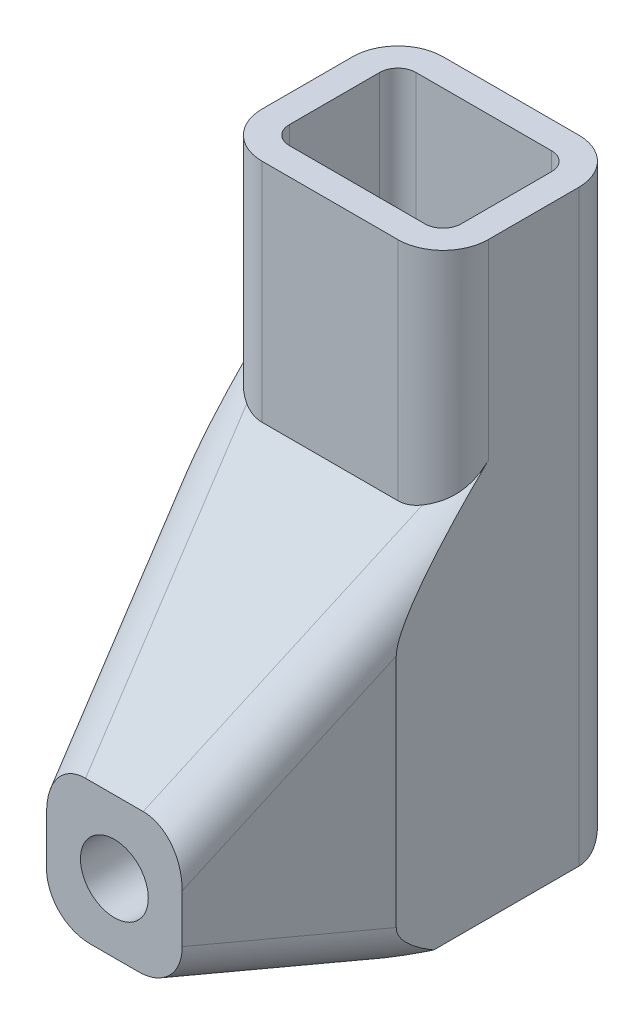
ISO-10303-21;
HEADER;
FILE_DESCRIPTION(('STEP AP214'),'2;1');
FILE_NAME('part.step','',(''),(''),'','','');
FILE_SCHEMA(('AUTOMOTIVE_DESIGN { 1 0 10303 214 1 1 1 1 }'));
ENDSEC;
DATA;
#1=APPLICATION_CONTEXT('core data for automotive mechanical design processes');
#2=APPLICATION_PROTOCOL_DEFINITION('international standard','automotive_design',2000,#1);
#3=PRODUCT_CONTEXT('',#1,'mechanical');
#4=PRODUCT('Part','Part','',(#3));
#5=PRODUCT_RELATED_PRODUCT_CATEGORY('part','',(#4));
#6=PRODUCT_DEFINITION_FORMATION('','',#4);
#7=PRODUCT_DEFINITION_CONTEXT('part definition',#1,'design');
#8=PRODUCT_DEFINITION('design','',#6,#7);
#9=PRODUCT_DEFINITION_SHAPE('','',#8);
#10=(LENGTH_UNIT() NAMED_UNIT(*) SI_UNIT(.MILLI.,.METRE.));
#11=(NAMED_UNIT(*) PLANE_ANGLE_UNIT() SI_UNIT($,.RADIAN.));
#12=(NAMED_UNIT(*) SI_UNIT($,.STERADIAN.) SOLID_ANGLE_UNIT());
#13=UNCERTAINTY_MEASURE_WITH_UNIT(LENGTH_MEASURE(1.E-05),#10,'distance_accuracy_value','');
#14=(GEOMETRIC_REPRESENTATION_CONTEXT(3) GLOBAL_UNCERTAINTY_ASSIGNED_CONTEXT((#13)) GLOBAL_UNIT_ASSIGNED_CONTEXT((#10,
#11,#12)) REPRESENTATION_CONTEXT('',''));
#15=CARTESIAN_POINT('',(0.,0.,0.));
#16=DIRECTION('',(0.,0.,1.));
#17=DIRECTION('',(1.,0.,0.));
#18=AXIS2_PLACEMENT_3D('',#15,#16,#17);
#19=CARTESIAN_POINT('',(12.5,0.,-43.8350718518843));
#20=DIRECTION('',(0.,1.,0.));
#21=DIRECTION('',(0.,0.,1.));
#22=AXIS2_PLACEMENT_3D('',#19,#20,#21);
#23=PLANE('',#22);
#24=DIRECTION('',(0.,0.,-1.));
#25=VECTOR('',#24,1.);
#26=CARTESIAN_POINT('',(12.5,0.,-43.8350718518843));
#27=LINE('',#26,#25);
#28=CARTESIAN_POINT('',(12.5,0.,-22.79743478346));
#29=VERTEX_POINT('',#28);
#30=CARTESIAN_POINT('',(12.5,0.,-38.8350718518843));
#31=VERTEX_POINT('',#30);
#32=EDGE_CURVE('E363',#29,#31,#27,.T.);
#33=ORIENTED_EDGE('',*,*,#32,.F.);
#34=CARTESIAN_POINT('',(11.8986793578384,0.,-35.734611375439));
#35=DIRECTION('',(0.,1.,0.));
#36=DIRECTION('',(0.258819045102518,0.,-0.965925826289069));
#37=AXIS2_PLACEMENT_3D('',#34,#35,#36);
#38=ELLIPSE('',#37,19.9550765660489,5.);
#39=CARTESIAN_POINT('',(7.06905022639315,0.,-16.4160948496579));
#40=VERTEX_POINT('',#39);
#41=EDGE_CURVE('E102',#29,#40,#38,.F.);
#42=ORIENTED_EDGE('',*,*,#41,.T.);
#43=DIRECTION('',(-1.,0.,0.));
#44=VECTOR('',#43,1.);
#45=CARTESIAN_POINT('',(12.5,0.,-16.4160948496579));
#46=LINE('',#45,#44);
#47=CARTESIAN_POINT('',(-7.06905022639315,0.,-16.4160948496579));
#48=VERTEX_POINT('',#47);
#49=EDGE_CURVE('E403',#40,#48,#46,.T.);
#50=ORIENTED_EDGE('',*,*,#49,.T.);
#51=CARTESIAN_POINT('',(-11.8986793578384,0.,-35.734611375439));
#52=DIRECTION('',(0.,1.,0.));
#53=DIRECTION('',(0.258819045102518,0.,0.965925826289069));
#54=AXIS2_PLACEMENT_3D('',#51,#52,#53);
#55=ELLIPSE('',#54,19.9550765660489,5.);
#56=CARTESIAN_POINT('',(-12.5,0.,-22.7974347834601));
#57=VERTEX_POINT('',#56);
#58=EDGE_CURVE('E302',#48,#57,#55,.F.);
#59=ORIENTED_EDGE('',*,*,#58,.T.);
#60=DIRECTION('',(0.,0.,-1.));
#61=VECTOR('',#60,1.);
#62=CARTESIAN_POINT('',(-12.5,0.,-43.8350718518843));
#63=LINE('',#62,#61);
#64=CARTESIAN_POINT('',(-12.5,0.,-38.8350718518843));
#65=VERTEX_POINT('',#64);
#66=EDGE_CURVE('E417',#57,#65,#63,.T.);
#67=ORIENTED_EDGE('',*,*,#66,.T.);
#68=DIRECTION('',(-1.,0.,0.));
#69=VECTOR('',#68,1.);
#70=CARTESIAN_POINT('',(12.5,0.,-38.8350718518843));
#71=LINE('',#70,#69);
#72=EDGE_CURVE('E300',#65,#31,#71,.F.);
#73=ORIENTED_EDGE('',*,*,#72,.T.);
#74=EDGE_LOOP('',(#33,#42,#50,#59,#67,#73));
#75=FACE_BOUND('',#74,.T.);
#76=ADVANCED_FACE('F39',(#75),#23,.F.);
#77=CARTESIAN_POINT('',(12.5,20.,0.));
#78=DIRECTION('',(0.,-0.766044443118979,-0.642787609686538));
#79=DIRECTION('',(0.,0.642787609686538,-0.766044443118979));
#80=AXIS2_PLACEMENT_3D('',#77,#78,#79);
#81=PLANE('',#80);
#82=DIRECTION('',(-1.,0.,0.));
#83=VECTOR('',#82,1.);
#84=CARTESIAN_POINT('',(12.5,20.,0.));
#85=LINE('',#84,#83);
#86=CARTESIAN_POINT('',(3.18479120255078,20.,0.));
#87=VERTEX_POINT('',#86);
#88=CARTESIAN_POINT('',(-3.18479120255077,20.,0.));
#89=VERTEX_POINT('',#88);
#90=EDGE_CURVE('E357',#87,#89,#85,.T.);
#91=ORIENTED_EDGE('',*,*,#90,.F.);
#92=DIRECTION('',(-0.201068962854536,-0.629660015175488,0.750399585198316));
#93=VECTOR('',#92,1.);
#94=CARTESIAN_POINT('',(8.35924960452398,36.2041396626117,-19.3113416578159));
#95=LINE('',#94,#93);
#96=CARTESIAN_POINT('',(9.70925475275788,40.4317651004517,-24.3496294615044));
#97=VERTEX_POINT('',#96);
#98=EDGE_CURVE('E63',#87,#97,#95,.F.);
#99=ORIENTED_EDGE('',*,*,#98,.T.);
#100=CARTESIAN_POINT('',(7.5,44.1954981558864,-28.8350718518843));
#101=DIRECTION('',(0.,-0.766044443118979,-0.642787609686538));
#102=DIRECTION('',(0.,-0.642787609686538,0.766044443118979));
#103=AXIS2_PLACEMENT_3D('',#100,#101,#102);
#104=ELLIPSE('',#103,6.52703644666138,5.);
#105=CARTESIAN_POINT('',(7.5,40.,-23.8350718518843));
#106=VERTEX_POINT('',#105);
#107=EDGE_CURVE('E216',#97,#106,#104,.T.);
#108=ORIENTED_EDGE('',*,*,#107,.T.);
#109=DIRECTION('',(-1.,0.,0.));
#110=VECTOR('',#109,1.);
#111=CARTESIAN_POINT('',(12.5,40.,-23.8350718518843));
#112=LINE('',#111,#110);
#113=CARTESIAN_POINT('',(-7.5,40.,-23.8350718518843));
#114=VERTEX_POINT('',#113);
#115=EDGE_CURVE('E355',#106,#114,#112,.T.);
#116=ORIENTED_EDGE('',*,*,#115,.T.);
#117=CARTESIAN_POINT('',(-7.5,44.1954981558864,-28.8350718518843));
#118=DIRECTION('',(0.,-0.766044443118979,-0.642787609686538));
#119=DIRECTION('',(0.,0.642787609686538,-0.766044443118979));
#120=AXIS2_PLACEMENT_3D('',#117,#118,#119);
#121=ELLIPSE('',#120,6.52703644666138,5.);
#122=CARTESIAN_POINT('',(-9.70925475275788,40.4317651004517,-24.3496294615044));
#123=VERTEX_POINT('',#122);
#124=EDGE_CURVE('E223',#114,#123,#121,.T.);
#125=ORIENTED_EDGE('',*,*,#124,.T.);
#126=DIRECTION('',(-0.201068962854536,0.629660015175488,-0.750399585198316));
#127=VECTOR('',#126,1.);
#128=CARTESIAN_POINT('',(-3.35924960452399,20.546327381782,-0.651087619971307));
#129=LINE('',#128,#127);
#130=EDGE_CURVE('E308',#123,#89,#129,.F.);
#131=ORIENTED_EDGE('',*,*,#130,.T.);
#132=EDGE_LOOP('',(#91,#99,#108,#116,#125,#131));
#133=FACE_BOUND('',#132,.T.);
#134=ADVANCED_FACE('F272',(#133),#81,.F.);
#135=CARTESIAN_POINT('',(12.5,0.,0.));
#136=DIRECTION('',(0.,0.,-1.));
#137=DIRECTION('',(-1.,0.,0.));
#138=AXIS2_PLACEMENT_3D('',#135,#136,#137);
#139=PLANE('',#138);
#140=CARTESIAN_POINT('',(0.,12.,0.));
#141=DIRECTION('',(0.,0.,1.));
#142=DIRECTION('',(1.,0.,0.));
#143=AXIS2_PLACEMENT_3D('',#140,#141,#142);
#144=CIRCLE('',#143,3.75);
#145=CARTESIAN_POINT('',(3.75,12.,0.));
#146=VERTEX_POINT('',#145);
#147=EDGE_CURVE('E411',#146,#146,#144,.T.);
#148=ORIENTED_EDGE('',*,*,#147,.F.);
#149=EDGE_LOOP('',(#148));
#150=FACE_BOUND('',#149,.T.);
#151=DIRECTION('',(1.,0.,0.));
#152=VECTOR('',#151,1.);
#153=CARTESIAN_POINT('',(12.5,4.39867935783861,0.));
#154=LINE('',#153,#152);
#155=CARTESIAN_POINT('',(-2.67037086855466,4.39867935783861,0.));
#156=VERTEX_POINT('',#155);
#157=CARTESIAN_POINT('',(2.67037086855466,4.39867935783861,0.));
#158=VERTEX_POINT('',#157);
#159=EDGE_CURVE('E400',#156,#158,#154,.T.);
#160=ORIENTED_EDGE('',*,*,#159,.T.);
#161=CARTESIAN_POINT('',(2.32361909794959,9.57506025988903,0.));
#162=DIRECTION('',(0.,0.,-1.));
#163=DIRECTION('',(0.707106781186538,-0.707106781186558,0.));
#164=AXIS2_PLACEMENT_3D('',#161,#162,#163);
#165=ELLIPSE('',#164,5.34694665077412,5.);
#166=CARTESIAN_POINT('',(7.5,9.22830848928396,0.));
#167=VERTEX_POINT('',#166);
#168=EDGE_CURVE('E380',#158,#167,#165,.F.);
#169=ORIENTED_EDGE('',*,*,#168,.T.);
#170=DIRECTION('',(0.,-1.,0.));
#171=VECTOR('',#170,1.);
#172=CARTESIAN_POINT('',(7.5,40.,0.));
#173=LINE('',#172,#171);
#174=CARTESIAN_POINT('',(7.5,14.5588383797745,0.));
#175=VERTEX_POINT('',#174);
#176=EDGE_CURVE('E405',#175,#167,#173,.T.);
#177=ORIENTED_EDGE('',*,*,#176,.F.);
#178=CARTESIAN_POINT('',(2.32361909794959,13.4729635533386,0.));
#179=DIRECTION('',(0.,0.,-1.));
#180=DIRECTION('',(0.304196200670353,0.952609401327597,0.));
#181=AXIS2_PLACEMENT_3D('',#178,#179,#180);
#182=ELLIPSE('',#181,6.66311668959491,5.);
#183=EDGE_CURVE('E378',#175,#87,#182,.F.);
#184=ORIENTED_EDGE('',*,*,#183,.T.);
#185=ORIENTED_EDGE('',*,*,#90,.T.);
#186=CARTESIAN_POINT('',(-2.32361909794959,13.4729635533386,0.));
#187=DIRECTION('',(0.,0.,-1.));
#188=DIRECTION('',(0.304196200670353,-0.952609401327597,0.));
#189=AXIS2_PLACEMENT_3D('',#186,#187,#188);
#190=ELLIPSE('',#189,6.66311668959491,5.);
#191=CARTESIAN_POINT('',(-7.5,14.5588383797745,0.));
#192=VERTEX_POINT('',#191);
#193=EDGE_CURVE('E376',#89,#192,#190,.F.);
#194=ORIENTED_EDGE('',*,*,#193,.T.);
#195=DIRECTION('',(0.,-1.,0.));
#196=VECTOR('',#195,1.);
#197=CARTESIAN_POINT('',(-7.5,40.,0.));
#198=LINE('',#197,#196);
#199=CARTESIAN_POINT('',(-7.5,9.22830848928396,0.));
#200=VERTEX_POINT('',#199);
#201=EDGE_CURVE('E408',#192,#200,#198,.T.);
#202=ORIENTED_EDGE('',*,*,#201,.T.);
#203=CARTESIAN_POINT('',(-2.32361909794959,9.57506025988903,0.));
#204=DIRECTION('',(0.,0.,-1.));
#205=DIRECTION('',(0.707106781186538,0.707106781186558,0.));
#206=AXIS2_PLACEMENT_3D('',#203,#204,#205);
#207=ELLIPSE('',#206,5.34694665077412,5.);
#208=EDGE_CURVE('E374',#200,#156,#207,.F.);
#209=ORIENTED_EDGE('',*,*,#208,.T.);
#210=EDGE_LOOP('',(#160,#169,#177,#184,#185,#194,#202,#209));
#211=FACE_BOUND('',#210,.T.);
#212=ADVANCED_FACE('F279',(#150,#211),#139,.F.);
#213=CARTESIAN_POINT('',(12.5,0.,0.));
#214=DIRECTION('',(-1.,0.,0.));
#215=DIRECTION('',(0.,0.,1.));
#216=AXIS2_PLACEMENT_3D('',#213,#214,#215);
#217=PLANE('',#216);
#218=DIRECTION('',(0.,0.,-1.));
#219=VECTOR('',#218,1.);
#220=CARTESIAN_POINT('',(12.5,65.,-23.8350718518843));
#221=LINE('',#220,#219);
#222=CARTESIAN_POINT('',(12.5,65.,-28.8350718518843));
#223=VERTEX_POINT('',#222);
#224=CARTESIAN_POINT('',(12.5,65.,-38.8350718518843));
#225=VERTEX_POINT('',#224);
#226=EDGE_CURVE('E222',#223,#225,#221,.T.);
#227=ORIENTED_EDGE('',*,*,#226,.F.);
#228=DIRECTION('',(0.,-1.,0.));
#229=VECTOR('',#228,1.);
#230=CARTESIAN_POINT('',(12.5,0.,-28.8350718518843));
#231=LINE('',#230,#229);
#232=CARTESIAN_POINT('',(12.5,43.8519243850956,-28.8350718518843));
#233=VERTEX_POINT('',#232);
#234=EDGE_CURVE('E214',#223,#233,#231,.T.);
#235=ORIENTED_EDGE('',*,*,#234,.T.);
#236=CARTESIAN_POINT('',(12.5,45.3409359258438,-37.9787705636262));
#237=DIRECTION('',(-1.,0.,0.));
#238=DIRECTION('',(0.,0.642787609686538,-0.76604444311898));
#239=AXIS2_PLACEMENT_3D('',#236,#237,#238);
#240=ELLIPSE('',#239,24.8670900223287,5.);
#241=CARTESIAN_POINT('',(12.5,30.2166506606042,-18.6602540378446));
#242=VERTEX_POINT('',#241);
#243=EDGE_CURVE('E197',#233,#242,#240,.F.);
#244=ORIENTED_EDGE('',*,*,#243,.T.);
#245=DIRECTION('',(0.,1.,0.));
#246=VECTOR('',#245,1.);
#247=CARTESIAN_POINT('',(12.5,0.,-18.6602540378446));
#248=LINE('',#247,#246);
#249=CARTESIAN_POINT('',(12.5,4.22830848928382,-18.6602540378446));
#250=VERTEX_POINT('',#249);
#251=EDGE_CURVE('E360',#250,#242,#248,.T.);
#252=ORIENTED_EDGE('',*,*,#251,.F.);
#253=CARTESIAN_POINT('',(12.5,-0.601320642161668,-37.9787705636262));
#254=DIRECTION('',(-1.,0.,0.));
#255=DIRECTION('',(0.,-0.258819045102525,-0.965925826289067));
#256=AXIS2_PLACEMENT_3D('',#253,#254,#255);
#257=ELLIPSE('',#256,19.9550765660495,5.);
#258=EDGE_CURVE('E208',#250,#29,#257,.F.);
#259=ORIENTED_EDGE('',*,*,#258,.T.);
#260=ORIENTED_EDGE('',*,*,#32,.T.);
#261=DIRECTION('',(0.,1.,0.));
#262=VECTOR('',#261,1.);
#263=CARTESIAN_POINT('',(12.5,0.,-38.8350718518843));
#264=LINE('',#263,#262);
#265=EDGE_CURVE('E209',#31,#225,#264,.T.);
#266=ORIENTED_EDGE('',*,*,#265,.T.);
#267=EDGE_LOOP('',(#227,#235,#244,#252,#259,#260,#266));
#268=FACE_BOUND('',#267,.T.);
#269=ADVANCED_FACE('F220',(#268),#217,.F.);
#270=CARTESIAN_POINT('',(-12.5,0.,0.));
#271=DIRECTION('',(-1.,0.,0.));
#272=DIRECTION('',(0.,0.,1.));
#273=AXIS2_PLACEMENT_3D('',#270,#271,#272);
#274=PLANE('',#273);
#275=CARTESIAN_POINT('',(-12.5,45.3409359258437,-37.9787705636262));
#276=DIRECTION('',(-1.,0.,0.));
#277=DIRECTION('',(0.,-0.642787609686538,0.76604444311898));
#278=AXIS2_PLACEMENT_3D('',#275,#276,#277);
#279=ELLIPSE('',#278,24.8670900223286,5.);
#280=CARTESIAN_POINT('',(-12.5,30.2166506606042,-18.6602540378446));
#281=VERTEX_POINT('',#280);
#282=CARTESIAN_POINT('',(-12.5,43.8519243850956,-28.8350718518843));
#283=VERTEX_POINT('',#282);
#284=EDGE_CURVE('E320',#281,#283,#279,.T.);
#285=ORIENTED_EDGE('',*,*,#284,.T.);
#286=DIRECTION('',(0.,-1.,0.));
#287=VECTOR('',#286,1.);
#288=CARTESIAN_POINT('',(-12.5,65.,-28.8350718518843));
#289=LINE('',#288,#287);
#290=CARTESIAN_POINT('',(-12.5,65.,-28.8350718518843));
#291=VERTEX_POINT('',#290);
#292=EDGE_CURVE('E345',#283,#291,#289,.F.);
#293=ORIENTED_EDGE('',*,*,#292,.T.);
#294=DIRECTION('',(0.,0.,1.));
#295=VECTOR('',#294,1.);
#296=CARTESIAN_POINT('',(-12.5,65.,-23.8350718518843));
#297=LINE('',#296,#295);
#298=CARTESIAN_POINT('',(-12.5,65.,-38.8350718518843));
#299=VERTEX_POINT('',#298);
#300=EDGE_CURVE('E391',#299,#291,#297,.T.);
#301=ORIENTED_EDGE('',*,*,#300,.F.);
#302=DIRECTION('',(0.,1.,0.));
#303=VECTOR('',#302,1.);
#304=CARTESIAN_POINT('',(-12.5,0.,-38.8350718518843));
#305=LINE('',#304,#303);
#306=EDGE_CURVE('E316',#299,#65,#305,.F.);
#307=ORIENTED_EDGE('',*,*,#306,.T.);
#308=ORIENTED_EDGE('',*,*,#66,.F.);
#309=CARTESIAN_POINT('',(-12.5,-0.601320642161668,-37.9787705636262));
#310=DIRECTION('',(-1.,0.,0.));
#311=DIRECTION('',(0.,0.258819045102525,0.965925826289067));
#312=AXIS2_PLACEMENT_3D('',#309,#310,#311);
#313=ELLIPSE('',#312,19.9550765660495,5.);
#314=CARTESIAN_POINT('',(-12.5,4.22830848928382,-18.6602540378446));
#315=VERTEX_POINT('',#314);
#316=EDGE_CURVE('E318',#57,#315,#313,.T.);
#317=ORIENTED_EDGE('',*,*,#316,.T.);
#318=DIRECTION('',(0.,1.,0.));
#319=VECTOR('',#318,1.);
#320=CARTESIAN_POINT('',(-12.5,0.,-18.6602540378446));
#321=LINE('',#320,#319);
#322=EDGE_CURVE('E356',#315,#281,#321,.T.);
#323=ORIENTED_EDGE('',*,*,#322,.T.);
#324=EDGE_LOOP('',(#285,#293,#301,#307,#308,#317,#323));
#325=FACE_BOUND('',#324,.T.);
#326=ADVANCED_FACE('F428',(#325),#274,.T.);
#327=CARTESIAN_POINT('',(12.5,40.,-43.8350718518843));
#328=DIRECTION('',(0.,0.,1.));
#329=DIRECTION('',(1.,0.,0.));
#330=AXIS2_PLACEMENT_3D('',#327,#328,#329);
#331=PLANE('',#330);
#332=CARTESIAN_POINT('',(0.,12.,-43.8350718518843));
#333=DIRECTION('',(0.,0.,1.));
#334=DIRECTION('',(1.,0.,0.));
#335=AXIS2_PLACEMENT_3D('',#332,#333,#334);
#336=CIRCLE('',#335,3.75);
#337=CARTESIAN_POINT('',(3.75,12.,-43.8350718518843));
#338=VERTEX_POINT('',#337);
#339=EDGE_CURVE('E414',#338,#338,#336,.T.);
#340=ORIENTED_EDGE('',*,*,#339,.T.);
#341=EDGE_LOOP('',(#340));
#342=FACE_BOUND('',#341,.T.);
#343=DIRECTION('',(-1.,0.,0.));
#344=VECTOR('',#343,1.);
#345=CARTESIAN_POINT('',(12.5,5.,-43.8350718518843));
#346=LINE('',#345,#344);
#347=CARTESIAN_POINT('',(7.5,5.,-43.8350718518843));
#348=VERTEX_POINT('',#347);
#349=CARTESIAN_POINT('',(-7.5,5.,-43.8350718518843));
#350=VERTEX_POINT('',#349);
#351=EDGE_CURVE('E324',#348,#350,#346,.T.);
#352=ORIENTED_EDGE('',*,*,#351,.T.);
#353=DIRECTION('',(0.,1.,0.));
#354=VECTOR('',#353,1.);
#355=CARTESIAN_POINT('',(-7.5,65.,-43.8350718518843));
#356=LINE('',#355,#354);
#357=CARTESIAN_POINT('',(-7.5,65.,-43.8350718518843));
#358=VERTEX_POINT('',#357);
#359=EDGE_CURVE('E327',#350,#358,#356,.T.);
#360=ORIENTED_EDGE('',*,*,#359,.T.);
#361=DIRECTION('',(-1.,0.,0.));
#362=VECTOR('',#361,1.);
#363=CARTESIAN_POINT('',(12.5,65.,-43.8350718518843));
#364=LINE('',#363,#362);
#365=CARTESIAN_POINT('',(7.5,65.,-43.8350718518843));
#366=VERTEX_POINT('',#365);
#367=EDGE_CURVE('E340',#366,#358,#364,.T.);
#368=ORIENTED_EDGE('',*,*,#367,.F.);
#369=DIRECTION('',(0.,1.,0.));
#370=VECTOR('',#369,1.);
#371=CARTESIAN_POINT('',(7.5,40.,-43.8350718518843));
#372=LINE('',#371,#370);
#373=EDGE_CURVE('E322',#366,#348,#372,.F.);
#374=ORIENTED_EDGE('',*,*,#373,.T.);
#375=EDGE_LOOP('',(#352,#360,#368,#374));
#376=FACE_BOUND('',#375,.T.);
#377=ADVANCED_FACE('F282',(#342,#376),#331,.F.);
#378=CARTESIAN_POINT('',(0.,12.,-50.));
#379=DIRECTION('',(0.,0.,1.));
#380=DIRECTION('',(1.,0.,0.));
#381=AXIS2_PLACEMENT_3D('',#378,#379,#380);
#382=CYLINDRICAL_SURFACE('',#381,3.75);
#383=ORIENTED_EDGE('',*,*,#147,.T.);
#384=EDGE_LOOP('',(#383));
#385=FACE_BOUND('',#384,.T.);
#386=ORIENTED_EDGE('',*,*,#339,.F.);
#387=EDGE_LOOP('',(#386));
#388=FACE_BOUND('',#387,.T.);
#389=ADVANCED_FACE('F454',(#385,#388),#382,.F.);
#390=CARTESIAN_POINT('',(-15.,40.,-27.9903810567669));
#391=DIRECTION('',(-0.965925826289069,0.,0.258819045102518));
#392=DIRECTION('',(0.258819045102518,0.,0.965925826289069));
#393=AXIS2_PLACEMENT_3D('',#390,#391,#392);
#394=PLANE('',#393);
#395=ORIENTED_EDGE('',*,*,#201,.F.);
#396=DIRECTION('',(-0.201068962854536,0.629660015175488,-0.750399585198316));
#397=VECTOR('',#396,1.);
#398=CARTESIAN_POINT('',(-13.1888787359693,32.3739174470168,-21.231184480736));
#399=LINE('',#398,#397);
#400=EDGE_CURVE('E313',#192,#281,#399,.T.);
#401=ORIENTED_EDGE('',*,*,#400,.T.);
#402=ORIENTED_EDGE('',*,*,#322,.F.);
#403=DIRECTION('',(-0.250562807085729,-0.250562807085736,-0.935113126531029));
#404=VECTOR('',#403,1.);
#405=CARTESIAN_POINT('',(-7.80321242525745,8.9250960640265,-1.13160417654699));
#406=LINE('',#405,#404);
#407=EDGE_CURVE('E311',#315,#200,#406,.F.);
#408=ORIENTED_EDGE('',*,*,#407,.T.);
#409=EDGE_LOOP('',(#395,#401,#402,#408));
#410=FACE_BOUND('',#409,.T.);
#411=ADVANCED_FACE('F439',(#410),#394,.T.);
#412=CARTESIAN_POINT('',(7.5,40.,0.));
#413=DIRECTION('',(0.965925826289069,0.,0.258819045102518));
#414=DIRECTION('',(0.258819045102518,0.,-0.965925826289069));
#415=AXIS2_PLACEMENT_3D('',#412,#413,#414);
#416=PLANE('',#415);
#417=ORIENTED_EDGE('',*,*,#176,.T.);
#418=DIRECTION('',(-0.250562807085728,0.250562807085736,0.935113126531029));
#419=VECTOR('',#418,1.);
#420=CARTESIAN_POINT('',(12.2018917830959,4.5264167061879,-17.5476990262048));
#421=LINE('',#420,#419);
#422=EDGE_CURVE('E297',#167,#250,#421,.F.);
#423=ORIENTED_EDGE('',*,*,#422,.T.);
#424=ORIENTED_EDGE('',*,*,#251,.T.);
#425=DIRECTION('',(-0.201068962854536,-0.629660015175488,0.750399585198316));
#426=VECTOR('',#425,1.);
#427=CARTESIAN_POINT('',(8.18887873596933,16.7161051661871,-2.5709304428914));
#428=LINE('',#427,#426);
#429=EDGE_CURVE('E203',#242,#175,#428,.T.);
#430=ORIENTED_EDGE('',*,*,#429,.T.);
#431=EDGE_LOOP('',(#417,#423,#424,#430));
#432=FACE_BOUND('',#431,.T.);
#433=ADVANCED_FACE('F447',(#432),#416,.T.);
#434=CARTESIAN_POINT('',(-12.5,5.47047612756312,4.));
#435=DIRECTION('',(0.,0.965925826289067,-0.258819045102525));
#436=DIRECTION('',(0.,0.258819045102525,0.965925826289067));
#437=AXIS2_PLACEMENT_3D('',#434,#435,#436);
#438=PLANE('',#437);
#439=ORIENTED_EDGE('',*,*,#49,.F.);
#440=DIRECTION('',(-0.250562807085729,0.250562807085736,0.935113126531029));
#441=VECTOR('',#440,1.);
#442=CARTESIAN_POINT('',(2.9735832938121,4.09546693258116,-1.13160417654696));
#443=LINE('',#442,#441);
#444=EDGE_CURVE('E371',#40,#158,#443,.T.);
#445=ORIENTED_EDGE('',*,*,#444,.T.);
#446=ORIENTED_EDGE('',*,*,#159,.F.);
#447=DIRECTION('',(-0.250562807085729,-0.250562807085736,-0.935113126531029));
#448=VECTOR('',#447,1.);
#449=CARTESIAN_POINT('',(-7.37226265165059,-0.303212425257447,-17.5476990262048));
#450=LINE('',#449,#448);
#451=EDGE_CURVE('E368',#156,#48,#450,.T.);
#452=ORIENTED_EDGE('',*,*,#451,.T.);
#453=EDGE_LOOP('',(#439,#445,#446,#452));
#454=FACE_BOUND('',#453,.T.);
#455=ADVANCED_FACE('F445',(#454),#438,.F.);
#456=CARTESIAN_POINT('',(12.5,65.,-23.8350718518843));
#457=DIRECTION('',(0.,0.,-1.));
#458=DIRECTION('',(-1.,0.,0.));
#459=AXIS2_PLACEMENT_3D('',#456,#457,#458);
#460=PLANE('',#459);
#461=DIRECTION('',(1.,0.,0.));
#462=VECTOR('',#461,1.);
#463=CARTESIAN_POINT('',(12.5,65.,-23.8350718518843));
#464=LINE('',#463,#462);
#465=CARTESIAN_POINT('',(-7.5,65.,-23.8350718518843));
#466=VERTEX_POINT('',#465);
#467=CARTESIAN_POINT('',(7.5,65.,-23.8350718518843));
#468=VERTEX_POINT('',#467);
#469=EDGE_CURVE('E350',#466,#468,#464,.T.);
#470=ORIENTED_EDGE('',*,*,#469,.F.);
#471=DIRECTION('',(0.,-1.,0.));
#472=VECTOR('',#471,1.);
#473=CARTESIAN_POINT('',(-7.5,38.6519846658481,-23.8350718518843));
#474=LINE('',#473,#472);
#475=EDGE_CURVE('E342',#466,#114,#474,.T.);
#476=ORIENTED_EDGE('',*,*,#475,.T.);
#477=ORIENTED_EDGE('',*,*,#115,.F.);
#478=DIRECTION('',(0.,-1.,0.));
#479=VECTOR('',#478,1.);
#480=CARTESIAN_POINT('',(7.5,65.,-23.8350718518843));
#481=LINE('',#480,#479);
#482=EDGE_CURVE('E333',#106,#468,#481,.F.);
#483=ORIENTED_EDGE('',*,*,#482,.T.);
#484=EDGE_LOOP('',(#470,#476,#477,#483));
#485=FACE_BOUND('',#484,.T.);
#486=ADVANCED_FACE('F292',(#485),#460,.F.);
#487=CARTESIAN_POINT('',(0.,65.,0.));
#488=DIRECTION('',(0.,1.,0.));
#489=DIRECTION('',(0.,0.,1.));
#490=AXIS2_PLACEMENT_3D('',#487,#488,#489);
#491=PLANE('',#490);
#492=CARTESIAN_POINT('',(-7.5,65.,-38.8350718518843));
#493=DIRECTION('',(0.,1.,0.));
#494=DIRECTION('',(0.,0.,1.));
#495=AXIS2_PLACEMENT_3D('',#492,#493,#494);
#496=CIRCLE('',#495,2.);
#497=CARTESIAN_POINT('',(-7.5,65.,-40.8350718518843));
#498=VERTEX_POINT('',#497);
#499=CARTESIAN_POINT('',(-9.5,65.,-38.8350718518843));
#500=VERTEX_POINT('',#499);
#501=EDGE_CURVE('E11',#498,#500,#496,.T.);
#502=ORIENTED_EDGE('',*,*,#501,.F.);
#503=DIRECTION('',(-1.,0.,0.));
#504=VECTOR('',#503,1.);
#505=CARTESIAN_POINT('',(7.5,65.,-40.8350718518843));
#506=LINE('',#505,#504);
#507=CARTESIAN_POINT('',(7.5,65.,-40.8350718518843));
#508=VERTEX_POINT('',#507);
#509=EDGE_CURVE('E48',#508,#498,#506,.T.);
#510=ORIENTED_EDGE('',*,*,#509,.F.);
#511=CARTESIAN_POINT('',(7.5,65.,-38.8350718518843));
#512=DIRECTION('',(0.,1.,0.));
#513=DIRECTION('',(0.,0.,1.));
#514=AXIS2_PLACEMENT_3D('',#511,#512,#513);
#515=CIRCLE('',#514,2.);
#516=CARTESIAN_POINT('',(9.5,65.,-38.8350718518843));
#517=VERTEX_POINT('',#516);
#518=EDGE_CURVE('E740',#517,#508,#515,.T.);
#519=ORIENTED_EDGE('',*,*,#518,.F.);
#520=DIRECTION('',(0.,0.,-1.));
#521=VECTOR('',#520,1.);
#522=CARTESIAN_POINT('',(9.5,65.,-28.8350718518843));
#523=LINE('',#522,#521);
#524=CARTESIAN_POINT('',(9.5,65.,-28.8350718518843));
#525=VERTEX_POINT('',#524);
#526=EDGE_CURVE('E742',#525,#517,#523,.T.);
#527=ORIENTED_EDGE('',*,*,#526,.F.);
#528=CARTESIAN_POINT('',(7.5,65.,-28.8350718518843));
#529=DIRECTION('',(0.,1.,0.));
#530=DIRECTION('',(0.,0.,1.));
#531=AXIS2_PLACEMENT_3D('',#528,#529,#530);
#532=CIRCLE('',#531,2.);
#533=CARTESIAN_POINT('',(7.5,65.,-26.8350718518843));
#534=VERTEX_POINT('',#533);
#535=EDGE_CURVE('E746',#534,#525,#532,.T.);
#536=ORIENTED_EDGE('',*,*,#535,.F.);
#537=DIRECTION('',(1.,0.,0.));
#538=VECTOR('',#537,1.);
#539=CARTESIAN_POINT('',(-7.5,65.,-26.8350718518843));
#540=LINE('',#539,#538);
#541=CARTESIAN_POINT('',(-7.5,65.,-26.8350718518843));
#542=VERTEX_POINT('',#541);
#543=EDGE_CURVE('E748',#542,#534,#540,.T.);
#544=ORIENTED_EDGE('',*,*,#543,.F.);
#545=CARTESIAN_POINT('',(-7.5,65.,-28.8350718518843));
#546=DIRECTION('',(0.,1.,0.));
#547=DIRECTION('',(0.,0.,1.));
#548=AXIS2_PLACEMENT_3D('',#545,#546,#547);
#549=CIRCLE('',#548,2.);
#550=CARTESIAN_POINT('',(-9.5,65.,-28.8350718518843));
#551=VERTEX_POINT('',#550);
#552=EDGE_CURVE('E750',#551,#542,#549,.T.);
#553=ORIENTED_EDGE('',*,*,#552,.F.);
#554=DIRECTION('',(0.,0.,1.));
#555=VECTOR('',#554,1.);
#556=CARTESIAN_POINT('',(-9.5,65.,-38.8350718518843));
#557=LINE('',#556,#555);
#558=EDGE_CURVE('E752',#500,#551,#557,.T.);
#559=ORIENTED_EDGE('',*,*,#558,.F.);
#560=EDGE_LOOP('',(#502,#510,#519,#527,#536,#544,#553,#559));
#561=FACE_BOUND('',#560,.T.);
#562=ORIENTED_EDGE('',*,*,#300,.T.);
#563=CARTESIAN_POINT('',(-7.5,65.,-28.8350718518843));
#564=DIRECTION('',(0.,1.,0.));
#565=DIRECTION('',(0.,0.,1.));
#566=AXIS2_PLACEMENT_3D('',#563,#564,#565);
#567=CIRCLE('',#566,5.);
#568=EDGE_CURVE('E224',#291,#466,#567,.T.);
#569=ORIENTED_EDGE('',*,*,#568,.T.);
#570=ORIENTED_EDGE('',*,*,#469,.T.);
#571=CARTESIAN_POINT('',(7.5,65.,-28.8350718518843));
#572=DIRECTION('',(0.,1.,0.));
#573=DIRECTION('',(0.,0.,1.));
#574=AXIS2_PLACEMENT_3D('',#571,#572,#573);
#575=CIRCLE('',#574,5.);
#576=EDGE_CURVE('E228',#468,#223,#575,.T.);
#577=ORIENTED_EDGE('',*,*,#576,.T.);
#578=ORIENTED_EDGE('',*,*,#226,.T.);
#579=CARTESIAN_POINT('',(7.5,65.,-38.8350718518843));
#580=DIRECTION('',(0.,1.,0.));
#581=DIRECTION('',(0.,0.,1.));
#582=AXIS2_PLACEMENT_3D('',#579,#580,#581);
#583=CIRCLE('',#582,5.);
#584=EDGE_CURVE('E329',#225,#366,#583,.T.);
#585=ORIENTED_EDGE('',*,*,#584,.T.);
#586=ORIENTED_EDGE('',*,*,#367,.T.);
#587=CARTESIAN_POINT('',(-7.5,65.,-38.8350718518843));
#588=DIRECTION('',(0.,1.,0.));
#589=DIRECTION('',(0.,0.,1.));
#590=AXIS2_PLACEMENT_3D('',#587,#588,#589);
#591=CIRCLE('',#590,5.);
#592=EDGE_CURVE('E331',#358,#299,#591,.T.);
#593=ORIENTED_EDGE('',*,*,#592,.T.);
#594=EDGE_LOOP('',(#562,#569,#570,#577,#578,#585,#586,#593));
#595=FACE_BOUND('',#594,.T.);
#596=ADVANCED_FACE('F285',(#561,#595),#491,.T.);
#597=CARTESIAN_POINT('',(0.713441363203608,11.1852379946351,6.00926511528823));
#598=DIRECTION('',(0.250562807085728,-0.250562807085736,-0.935113126531029));
#599=DIRECTION('',(0.,0.965925826289067,-0.258819045102525));
#600=AXIS2_PLACEMENT_3D('',#597,#598,#599);
#601=CYLINDRICAL_SURFACE('',#600,5.);
#602=ORIENTED_EDGE('',*,*,#258,.F.);
#603=ORIENTED_EDGE('',*,*,#422,.F.);
#604=ORIENTED_EDGE('',*,*,#168,.F.);
#605=ORIENTED_EDGE('',*,*,#444,.F.);
#606=ORIENTED_EDGE('',*,*,#41,.F.);
#607=EDGE_LOOP('',(#602,#603,#604,#605,#606));
#608=FACE_BOUND('',#607,.T.);
#609=ADVANCED_FACE('F283',(#608),#601,.T.);
#610=CARTESIAN_POINT('',(5.89135132857012,24.645539860403,-13.314957952477));
#611=DIRECTION('',(0.201068962854536,0.629660015175488,-0.750399585198316));
#612=DIRECTION('',(0.,0.766044443118979,0.642787609686537));
#613=AXIS2_PLACEMENT_3D('',#610,#611,#612);
#614=CYLINDRICAL_SURFACE('',#613,5.);
#615=ORIENTED_EDGE('',*,*,#243,.F.);
#616=CARTESIAN_POINT('',(12.5,43.8519243850956,-28.8350718518843));
#617=CARTESIAN_POINT('',(12.499995471631,43.7787354178063,-28.7589843188988));
#618=CARTESIAN_POINT('',(12.4982634075435,43.7058512800638,-28.6826124839391));
#619=CARTESIAN_POINT('',(12.4912301147222,43.5608801148801,-28.5292527313501));
#620=CARTESIAN_POINT('',(12.4859282098558,43.4887932410714,-28.4522646997423));
#621=CARTESIAN_POINT('',(12.4644657224746,43.2737330502186,-28.2200047807736));
#622=CARTESIAN_POINT('',(12.4427473388642,43.1322874146015,-28.0637751088881));
#623=CARTESIAN_POINT('',(12.3831841530732,42.8550233907169,-27.7486628966057));
#624=CARTESIAN_POINT('',(12.3452991289314,42.7192199710768,-27.5897746956065));
#625=CARTESIAN_POINT('',(12.2518759798899,42.4556306222222,-27.2707017658711));
#626=CARTESIAN_POINT('',(12.1963554894519,42.327836836018,-27.1105184874055));
#627=CARTESIAN_POINT('',(12.0817412807224,42.1113453991604,-26.8288567132637));
#628=CARTESIAN_POINT('',(12.0266854606605,42.0206126320457,-26.7072933502409));
#629=CARTESIAN_POINT('',(11.9049590128266,41.8452514905386,-26.4655481621385));
#630=CARTESIAN_POINT('',(11.8382883104388,41.7606231553669,-26.3453663459394));
#631=CARTESIAN_POINT('',(11.6933674928111,41.5980699281581,-26.1083753750315));
#632=CARTESIAN_POINT('',(11.6151663629235,41.5201187819335,-25.9915543362198));
#633=CARTESIAN_POINT('',(11.4470616880375,41.3703853675187,-25.7624691136983));
#634=CARTESIAN_POINT('',(11.3571583475626,41.2986029915512,-25.6502048503933));
#635=CARTESIAN_POINT('',(11.1568926450205,41.1540023969072,-25.4215126200333));
#636=CARTESIAN_POINT('',(11.0453945706572,41.0817470642703,-25.3057206299153));
#637=CARTESIAN_POINT('',(10.8098891960144,40.9426709186284,-25.0839639890165));
#638=CARTESIAN_POINT('',(10.6858783293416,40.8758516648712,-24.9780021566366));
#639=CARTESIAN_POINT('',(10.4252011713696,40.7451651945764,-24.7766686620758));
#640=CARTESIAN_POINT('',(10.2883973037589,40.6813447213599,-24.6814442204075));
#641=CARTESIAN_POINT('',(10.0761513332723,40.5870607153408,-24.548999451451));
#642=CARTESIAN_POINT('',(10.0042226149603,40.5558711252535,-24.506579872092));
#643=CARTESIAN_POINT('',(9.85825921236872,40.493715656944,-24.4253563221896));
#644=CARTESIAN_POINT('',(9.7842245534964,40.4627497760285,-24.38655230805));
#645=CARTESIAN_POINT('',(9.70925475275774,40.4317651004521,-24.3496294615043));
#646=B_SPLINE_CURVE_WITH_KNOTS('',3,(#616,#617,#618,#619,#620,#621,#622,#623,#624,#625,#626,
#627,#628,#629,#630,#631,#632,#633,#634,#635,#636,#637,#638,#639,#640,#641,#642,#643,#644,#645),
.UNSPECIFIED.,.F.,.F.,(4,2,2,2,2,2,2,2,2,2,2,2,2,2,4),(0.,0.3166922113158,0.633444421456262,
1.26835708163019,1.90485867456759,2.54072579525666,3.02435668831353,3.50799068840363,
3.98962627607448,4.47125344716803,4.99914631041859,5.52719006088501,6.06176595859135,
6.32910139048201,6.59643359845155),.UNSPECIFIED.);
#647=EDGE_CURVE('E200',#233,#97,#646,.T.);
#648=ORIENTED_EDGE('',*,*,#647,.T.);
#649=ORIENTED_EDGE('',*,*,#98,.F.);
#650=ORIENTED_EDGE('',*,*,#183,.F.);
#651=ORIENTED_EDGE('',*,*,#429,.F.);
#652=EDGE_LOOP('',(#615,#648,#649,#650,#651));
#653=FACE_BOUND('',#652,.T.);
#654=ADVANCED_FACE('F199',(#653),#614,.T.);
#655=CARTESIAN_POINT('',(-10.4178133182391,38.8204382865127,-30.2079440764514));
#656=DIRECTION('',(0.201068962854536,-0.629660015175488,0.750399585198316));
#657=DIRECTION('',(0.,-0.766044443118979,-0.642787609686537));
#658=AXIS2_PLACEMENT_3D('',#655,#656,#657);
#659=CYLINDRICAL_SURFACE('',#658,5.);
#660=ORIENTED_EDGE('',*,*,#193,.F.);
#661=ORIENTED_EDGE('',*,*,#130,.F.);
#662=CARTESIAN_POINT('',(-9.70925475275788,40.4317651004517,-24.3496294615044));
#663=CARTESIAN_POINT('',(-9.77648932296577,40.4595526920161,-24.3827433282687));
#664=CARTESIAN_POINT('',(-9.84297310352619,40.4873258560312,-24.4173699263817));
#665=CARTESIAN_POINT('',(-9.97426782126655,40.5430312370219,-24.4895443571054));
#666=CARTESIAN_POINT('',(-10.039078749668,40.5709634548313,-24.5270922050415));
#667=CARTESIAN_POINT('',(-10.2307200360515,40.6552694398347,-24.643945932698));
#668=CARTESIAN_POINT('',(-10.3547845708988,40.7121629536948,-24.7274746572449));
#669=CARTESIAN_POINT('',(-10.5936229864789,40.8284974451054,-24.9042333902155));
#670=CARTESIAN_POINT('',(-10.7084317588146,40.887927425864,-24.9974236141285));
#671=CARTESIAN_POINT('',(-10.9281651005433,41.0108432874239,-25.1923736987622));
#672=CARTESIAN_POINT('',(-11.0330908065796,41.0743287004004,-25.2941325714539));
#673=CARTESIAN_POINT('',(-11.2324388738151,41.2066057432589,-25.5049065171562));
#674=CARTESIAN_POINT('',(-11.3268321161064,41.2754112348618,-25.6139404370369));
#675=CARTESIAN_POINT('',(-11.5042021846959,41.4189170637408,-25.8372884270271));
#676=CARTESIAN_POINT('',(-11.5871787315408,41.4936175452417,-25.9516026262937));
#677=CARTESIAN_POINT('',(-11.7414628156518,41.6492275095565,-26.1837664680623));
#678=CARTESIAN_POINT('',(-11.8127728472933,41.7301356596828,-26.3016153484341));
#679=CARTESIAN_POINT('',(-11.9438639518558,41.8980961836663,-26.5393139293201));
#680=CARTESIAN_POINT('',(-12.0036442072977,41.985148992592,-26.6591637710515));
#681=CARTESIAN_POINT('',(-12.1251928052287,42.1867551060952,-26.9286578666458));
#682=CARTESIAN_POINT('',(-12.1839457680688,42.3028677981543,-27.0784981651365));
#683=CARTESIAN_POINT('',(-12.285449987758,42.5427014165986,-27.3775291653168));
#684=CARTESIAN_POINT('',(-12.328194681003,42.6664254395778,-27.5267195758192));
#685=CARTESIAN_POINT('',(-12.398997264958,42.9200650049663,-27.8235670433916));
#686=CARTESIAN_POINT('',(-12.4270375667039,43.0499877604683,-27.9712220579706));
#687=CARTESIAN_POINT('',(-12.4695269485777,43.3142939648717,-28.2643447763471));
#688=CARTESIAN_POINT('',(-12.4839818250671,43.4486754860345,-28.4098133869041));
#689=CARTESIAN_POINT('',(-12.4947531183792,43.6288722997233,-28.6012725247746));
#690=CARTESIAN_POINT('',(-12.4967287327528,43.6733610676824,-28.6482556572381));
#691=CARTESIAN_POINT('',(-12.4993503942421,43.7625034195935,-28.7418842878414));
#692=CARTESIAN_POINT('',(-12.4999996734147,43.8071563366203,-28.7885303300634));
#693=CARTESIAN_POINT('',(-12.5,43.8519243850956,-28.8350718518843));
#694=B_SPLINE_CURVE_WITH_KNOTS('',3,(#662,#663,#664,#665,#666,#667,#668,#669,#670,#671,#672,
#673,#674,#675,#676,#677,#678,#679,#680,#681,#682,#683,#684,#685,#686,#687,#688,#689,#690,#691,
#692,#693),.UNSPECIFIED.,.F.,.F.,(4,2,2,2,2,2,2,2,2,2,2,2,2,2,2,4),(0.,0.239759412404542,
0.479520082719383,0.958950328056597,1.43647936665257,1.91395341779901,2.39271643185566,
2.8714911627993,3.35016339449818,3.82886955233757,4.42334308447783,5.01806009254164,
5.61348687033733,6.2086594876838,6.40285385922047,6.59657444434318),.UNSPECIFIED.);
#695=EDGE_CURVE('E217',#123,#283,#694,.T.);
#696=ORIENTED_EDGE('',*,*,#695,.T.);
#697=ORIENTED_EDGE('',*,*,#284,.F.);
#698=ORIENTED_EDGE('',*,*,#400,.F.);
#699=EDGE_LOOP('',(#660,#661,#696,#697,#698));
#700=FACE_BOUND('',#699,.T.);
#701=ADVANCED_FACE('F247',(#700),#659,.T.);
#702=CARTESIAN_POINT('',(-2.28298437057061,9.61569498726801,0.151650867130065));
#703=DIRECTION('',(0.250562807085728,0.250562807085736,0.935113126531029));
#704=DIRECTION('',(0.,-0.965925826289067,0.258819045102525));
#705=AXIS2_PLACEMENT_3D('',#702,#703,#704);
#706=CYLINDRICAL_SURFACE('',#705,5.);
#707=ORIENTED_EDGE('',*,*,#208,.F.);
#708=ORIENTED_EDGE('',*,*,#407,.F.);
#709=ORIENTED_EDGE('',*,*,#316,.F.);
#710=ORIENTED_EDGE('',*,*,#58,.F.);
#711=ORIENTED_EDGE('',*,*,#451,.F.);
#712=EDGE_LOOP('',(#707,#708,#709,#710,#711));
#713=FACE_BOUND('',#712,.T.);
#714=ADVANCED_FACE('F251',(#713),#706,.T.);
#715=CARTESIAN_POINT('',(7.5,0.,-38.8350718518843));
#716=DIRECTION('',(0.,1.,0.));
#717=DIRECTION('',(0.,0.,1.));
#718=AXIS2_PLACEMENT_3D('',#715,#716,#717);
#719=CYLINDRICAL_SURFACE('',#718,5.);
#720=ORIENTED_EDGE('',*,*,#584,.F.);
#721=ORIENTED_EDGE('',*,*,#265,.F.);
#722=CARTESIAN_POINT('',(7.5,5.,-38.8350718518843));
#723=DIRECTION('',(0.707106781186547,0.707106781186547,0.));
#724=DIRECTION('',(-0.707106781186547,0.707106781186547,0.));
#725=AXIS2_PLACEMENT_3D('',#722,#723,#724);
#726=ELLIPSE('',#725,7.07106781186547,5.);
#727=EDGE_CURVE('E336',#348,#31,#726,.F.);
#728=ORIENTED_EDGE('',*,*,#727,.F.);
#729=ORIENTED_EDGE('',*,*,#373,.F.);
#730=EDGE_LOOP('',(#720,#721,#728,#729));
#731=FACE_BOUND('',#730,.T.);
#732=ADVANCED_FACE('F257',(#731),#719,.T.);
#733=CARTESIAN_POINT('',(-7.5,40.,-38.8350718518843));
#734=DIRECTION('',(0.,-1.,0.));
#735=DIRECTION('',(0.,0.,-1.));
#736=AXIS2_PLACEMENT_3D('',#733,#734,#735);
#737=CYLINDRICAL_SURFACE('',#736,5.);
#738=ORIENTED_EDGE('',*,*,#592,.F.);
#739=ORIENTED_EDGE('',*,*,#359,.F.);
#740=CARTESIAN_POINT('',(-7.5,5.,-38.8350718518843));
#741=DIRECTION('',(0.707106781186547,-0.707106781186547,0.));
#742=DIRECTION('',(-0.707106781186547,-0.707106781186547,0.));
#743=AXIS2_PLACEMENT_3D('',#740,#741,#742);
#744=ELLIPSE('',#743,7.07106781186547,5.);
#745=EDGE_CURVE('E334',#65,#350,#744,.T.);
#746=ORIENTED_EDGE('',*,*,#745,.F.);
#747=ORIENTED_EDGE('',*,*,#306,.F.);
#748=EDGE_LOOP('',(#738,#739,#746,#747));
#749=FACE_BOUND('',#748,.T.);
#750=ADVANCED_FACE('F262',(#749),#737,.T.);
#751=CARTESIAN_POINT('',(12.5,5.,-38.8350718518843));
#752=DIRECTION('',(-1.,0.,0.));
#753=DIRECTION('',(0.,0.,1.));
#754=AXIS2_PLACEMENT_3D('',#751,#752,#753);
#755=CYLINDRICAL_SURFACE('',#754,5.);
#756=ORIENTED_EDGE('',*,*,#727,.T.);
#757=ORIENTED_EDGE('',*,*,#72,.F.);
#758=ORIENTED_EDGE('',*,*,#745,.T.);
#759=ORIENTED_EDGE('',*,*,#351,.F.);
#760=EDGE_LOOP('',(#756,#757,#758,#759));
#761=FACE_BOUND('',#760,.T.);
#762=ADVANCED_FACE('F259',(#761),#755,.T.);
#763=CARTESIAN_POINT('',(-7.5,65.,-28.8350718518843));
#764=DIRECTION('',(0.,1.,0.));
#765=DIRECTION('',(0.,0.,1.));
#766=AXIS2_PLACEMENT_3D('',#763,#764,#765);
#767=CYLINDRICAL_SURFACE('',#766,5.);
#768=ORIENTED_EDGE('',*,*,#568,.F.);
#769=ORIENTED_EDGE('',*,*,#292,.F.);
#770=ORIENTED_EDGE('',*,*,#695,.F.);
#771=ORIENTED_EDGE('',*,*,#124,.F.);
#772=ORIENTED_EDGE('',*,*,#475,.F.);
#773=EDGE_LOOP('',(#768,#769,#770,#771,#772));
#774=FACE_BOUND('',#773,.T.);
#775=ADVANCED_FACE('F244',(#774),#767,.T.);
#776=CARTESIAN_POINT('',(7.5,0.,-28.8350718518843));
#777=DIRECTION('',(0.,-1.,0.));
#778=DIRECTION('',(0.,0.,-1.));
#779=AXIS2_PLACEMENT_3D('',#776,#777,#778);
#780=CYLINDRICAL_SURFACE('',#779,5.);
#781=ORIENTED_EDGE('',*,*,#576,.F.);
#782=ORIENTED_EDGE('',*,*,#482,.F.);
#783=ORIENTED_EDGE('',*,*,#107,.F.);
#784=ORIENTED_EDGE('',*,*,#647,.F.);
#785=ORIENTED_EDGE('',*,*,#234,.F.);
#786=EDGE_LOOP('',(#781,#782,#783,#784,#785));
#787=FACE_BOUND('',#786,.T.);
#788=ADVANCED_FACE('F41',(#787),#780,.T.);
#789=CARTESIAN_POINT('',(-7.5,40.,-38.8350718518843));
#790=DIRECTION('',(0.,1.,0.));
#791=DIRECTION('',(0.,0.,1.));
#792=AXIS2_PLACEMENT_3D('',#789,#790,#791);
#793=CYLINDRICAL_SURFACE('',#792,2.);
#794=ORIENTED_EDGE('',*,*,#501,.T.);
#795=DIRECTION('',(0.,1.,0.));
#796=VECTOR('',#795,1.);
#797=CARTESIAN_POINT('',(-9.5,40.,-38.8350718518843));
#798=LINE('',#797,#796);
#799=CARTESIAN_POINT('',(-9.5,40.,-38.8350718518843));
#800=VERTEX_POINT('',#799);
#801=EDGE_CURVE('E55',#800,#500,#798,.T.);
#802=ORIENTED_EDGE('',*,*,#801,.F.);
#803=CARTESIAN_POINT('',(-7.5,40.,-38.8350718518843));
#804=DIRECTION('',(0.,1.,0.));
#805=DIRECTION('',(0.,0.,1.));
#806=AXIS2_PLACEMENT_3D('',#803,#804,#805);
#807=CIRCLE('',#806,2.);
#808=CARTESIAN_POINT('',(-7.5,40.,-40.8350718518843));
#809=VERTEX_POINT('',#808);
#810=EDGE_CURVE('E693',#809,#800,#807,.T.);
#811=ORIENTED_EDGE('',*,*,#810,.F.);
#812=DIRECTION('',(0.,1.,0.));
#813=VECTOR('',#812,1.);
#814=CARTESIAN_POINT('',(-7.5,40.,-40.8350718518843));
#815=LINE('',#814,#813);
#816=EDGE_CURVE('E337',#809,#498,#815,.T.);
#817=ORIENTED_EDGE('',*,*,#816,.T.);
#818=EDGE_LOOP('',(#794,#802,#811,#817));
#819=FACE_BOUND('',#818,.T.);
#820=ADVANCED_FACE('F541',(#819),#793,.F.);
#821=CARTESIAN_POINT('',(7.5,40.,-40.8350718518843));
#822=DIRECTION('',(0.,0.,-1.));
#823=DIRECTION('',(-1.,0.,0.));
#824=AXIS2_PLACEMENT_3D('',#821,#822,#823);
#825=PLANE('',#824);
#826=ORIENTED_EDGE('',*,*,#509,.T.);
#827=ORIENTED_EDGE('',*,*,#816,.F.);
#828=DIRECTION('',(-1.,0.,0.));
#829=VECTOR('',#828,1.);
#830=CARTESIAN_POINT('',(7.5,40.,-40.8350718518843));
#831=LINE('',#830,#829);
#832=CARTESIAN_POINT('',(7.5,40.,-40.8350718518843));
#833=VERTEX_POINT('',#832);
#834=EDGE_CURVE('E699',#833,#809,#831,.T.);
#835=ORIENTED_EDGE('',*,*,#834,.F.);
#836=DIRECTION('',(0.,1.,0.));
#837=VECTOR('',#836,1.);
#838=CARTESIAN_POINT('',(7.5,40.,-40.8350718518843));
#839=LINE('',#838,#837);
#840=EDGE_CURVE('E395',#833,#508,#839,.T.);
#841=ORIENTED_EDGE('',*,*,#840,.T.);
#842=EDGE_LOOP('',(#826,#827,#835,#841));
#843=FACE_BOUND('',#842,.T.);
#844=ADVANCED_FACE('F553',(#843),#825,.F.);
#845=CARTESIAN_POINT('',(7.5,40.,-38.8350718518843));
#846=DIRECTION('',(0.,1.,0.));
#847=DIRECTION('',(0.,0.,1.));
#848=AXIS2_PLACEMENT_3D('',#845,#846,#847);
#849=CYLINDRICAL_SURFACE('',#848,2.);
#850=ORIENTED_EDGE('',*,*,#518,.T.);
#851=ORIENTED_EDGE('',*,*,#840,.F.);
#852=CARTESIAN_POINT('',(7.5,40.,-38.8350718518843));
#853=DIRECTION('',(0.,1.,0.));
#854=DIRECTION('',(0.,0.,1.));
#855=AXIS2_PLACEMENT_3D('',#852,#853,#854);
#856=CIRCLE('',#855,2.);
#857=CARTESIAN_POINT('',(9.5,40.,-38.8350718518843));
#858=VERTEX_POINT('',#857);
#859=EDGE_CURVE('E715',#858,#833,#856,.T.);
#860=ORIENTED_EDGE('',*,*,#859,.F.);
#861=DIRECTION('',(0.,1.,0.));
#862=VECTOR('',#861,1.);
#863=CARTESIAN_POINT('',(9.5,40.,-38.8350718518843));
#864=LINE('',#863,#862);
#865=EDGE_CURVE('E731',#858,#517,#864,.T.);
#866=ORIENTED_EDGE('',*,*,#865,.T.);
#867=EDGE_LOOP('',(#850,#851,#860,#866));
#868=FACE_BOUND('',#867,.T.);
#869=ADVANCED_FACE('F562',(#868),#849,.F.);
#870=CARTESIAN_POINT('',(9.5,40.,-28.8350718518843));
#871=DIRECTION('',(1.,0.,0.));
#872=DIRECTION('',(0.,0.,-1.));
#873=AXIS2_PLACEMENT_3D('',#870,#871,#872);
#874=PLANE('',#873);
#875=ORIENTED_EDGE('',*,*,#526,.T.);
#876=ORIENTED_EDGE('',*,*,#865,.F.);
#877=DIRECTION('',(0.,0.,-1.));
#878=VECTOR('',#877,1.);
#879=CARTESIAN_POINT('',(9.5,40.,-28.8350718518843));
#880=LINE('',#879,#878);
#881=CARTESIAN_POINT('',(9.5,40.,-28.8350718518843));
#882=VERTEX_POINT('',#881);
#883=EDGE_CURVE('E712',#882,#858,#880,.T.);
#884=ORIENTED_EDGE('',*,*,#883,.F.);
#885=DIRECTION('',(0.,1.,0.));
#886=VECTOR('',#885,1.);
#887=CARTESIAN_POINT('',(9.5,40.,-28.8350718518843));
#888=LINE('',#887,#886);
#889=EDGE_CURVE('E729',#882,#525,#888,.T.);
#890=ORIENTED_EDGE('',*,*,#889,.T.);
#891=EDGE_LOOP('',(#875,#876,#884,#890));
#892=FACE_BOUND('',#891,.T.);
#893=ADVANCED_FACE('F570',(#892),#874,.F.);
#894=CARTESIAN_POINT('',(7.5,40.,-28.8350718518843));
#895=DIRECTION('',(0.,1.,0.));
#896=DIRECTION('',(0.,0.,1.));
#897=AXIS2_PLACEMENT_3D('',#894,#895,#896);
#898=CYLINDRICAL_SURFACE('',#897,2.);
#899=ORIENTED_EDGE('',*,*,#535,.T.);
#900=ORIENTED_EDGE('',*,*,#889,.F.);
#901=CARTESIAN_POINT('',(7.5,40.,-28.8350718518843));
#902=DIRECTION('',(0.,1.,0.));
#903=DIRECTION('',(0.,0.,1.));
#904=AXIS2_PLACEMENT_3D('',#901,#902,#903);
#905=CIRCLE('',#904,2.);
#906=CARTESIAN_POINT('',(7.5,40.,-26.8350718518843));
#907=VERTEX_POINT('',#906);
#908=EDGE_CURVE('E709',#907,#882,#905,.T.);
#909=ORIENTED_EDGE('',*,*,#908,.F.);
#910=DIRECTION('',(0.,1.,0.));
#911=VECTOR('',#910,1.);
#912=CARTESIAN_POINT('',(7.5,40.,-26.8350718518843));
#913=LINE('',#912,#911);
#914=EDGE_CURVE('E725',#907,#534,#913,.T.);
#915=ORIENTED_EDGE('',*,*,#914,.T.);
#916=EDGE_LOOP('',(#899,#900,#909,#915));
#917=FACE_BOUND('',#916,.T.);
#918=ADVANCED_FACE('F579',(#917),#898,.F.);
#919=CARTESIAN_POINT('',(-7.5,40.,-26.8350718518843));
#920=DIRECTION('',(0.,0.,1.));
#921=DIRECTION('',(1.,0.,0.));
#922=AXIS2_PLACEMENT_3D('',#919,#920,#921);
#923=PLANE('',#922);
#924=ORIENTED_EDGE('',*,*,#543,.T.);
#925=ORIENTED_EDGE('',*,*,#914,.F.);
#926=DIRECTION('',(1.,0.,0.));
#927=VECTOR('',#926,1.);
#928=CARTESIAN_POINT('',(-7.5,40.,-26.8350718518843));
#929=LINE('',#928,#927);
#930=CARTESIAN_POINT('',(-7.5,40.,-26.8350718518843));
#931=VERTEX_POINT('',#930);
#932=EDGE_CURVE('E706',#931,#907,#929,.T.);
#933=ORIENTED_EDGE('',*,*,#932,.F.);
#934=DIRECTION('',(0.,1.,0.));
#935=VECTOR('',#934,1.);
#936=CARTESIAN_POINT('',(-7.5,40.,-26.8350718518843));
#937=LINE('',#936,#935);
#938=EDGE_CURVE('E722',#931,#542,#937,.T.);
#939=ORIENTED_EDGE('',*,*,#938,.T.);
#940=EDGE_LOOP('',(#924,#925,#933,#939));
#941=FACE_BOUND('',#940,.T.);
#942=ADVANCED_FACE('F588',(#941),#923,.F.);
#943=CARTESIAN_POINT('',(-7.5,40.,-28.8350718518843));
#944=DIRECTION('',(0.,1.,0.));
#945=DIRECTION('',(0.,0.,1.));
#946=AXIS2_PLACEMENT_3D('',#943,#944,#945);
#947=CYLINDRICAL_SURFACE('',#946,2.);
#948=ORIENTED_EDGE('',*,*,#552,.T.);
#949=ORIENTED_EDGE('',*,*,#938,.F.);
#950=CARTESIAN_POINT('',(-7.5,40.,-28.8350718518843));
#951=DIRECTION('',(0.,1.,0.));
#952=DIRECTION('',(0.,0.,1.));
#953=AXIS2_PLACEMENT_3D('',#950,#951,#952);
#954=CIRCLE('',#953,2.);
#955=CARTESIAN_POINT('',(-9.5,40.,-28.8350718518843));
#956=VERTEX_POINT('',#955);
#957=EDGE_CURVE('E702',#956,#931,#954,.T.);
#958=ORIENTED_EDGE('',*,*,#957,.F.);
#959=DIRECTION('',(0.,1.,0.));
#960=VECTOR('',#959,1.);
#961=CARTESIAN_POINT('',(-9.5,40.,-28.8350718518843));
#962=LINE('',#961,#960);
#963=EDGE_CURVE('E719',#956,#551,#962,.T.);
#964=ORIENTED_EDGE('',*,*,#963,.T.);
#965=EDGE_LOOP('',(#948,#949,#958,#964));
#966=FACE_BOUND('',#965,.T.);
#967=ADVANCED_FACE('F597',(#966),#947,.F.);
#968=CARTESIAN_POINT('',(-9.5,40.,-38.8350718518843));
#969=DIRECTION('',(-1.,0.,0.));
#970=DIRECTION('',(0.,0.,1.));
#971=AXIS2_PLACEMENT_3D('',#968,#969,#970);
#972=PLANE('',#971);
#973=ORIENTED_EDGE('',*,*,#558,.T.);
#974=ORIENTED_EDGE('',*,*,#963,.F.);
#975=DIRECTION('',(0.,0.,1.));
#976=VECTOR('',#975,1.);
#977=CARTESIAN_POINT('',(-9.5,40.,-38.8350718518843));
#978=LINE('',#977,#976);
#979=EDGE_CURVE('E696',#800,#956,#978,.T.);
#980=ORIENTED_EDGE('',*,*,#979,.F.);
#981=ORIENTED_EDGE('',*,*,#801,.T.);
#982=EDGE_LOOP('',(#973,#974,#980,#981));
#983=FACE_BOUND('',#982,.T.);
#984=ADVANCED_FACE('F606',(#983),#972,.F.);
#985=CARTESIAN_POINT('',(-7.5,40.,-38.8350718518843));
#986=DIRECTION('',(0.,1.,0.));
#987=DIRECTION('',(0.,0.,1.));
#988=AXIS2_PLACEMENT_3D('',#985,#986,#987);
#989=PLANE('',#988);
#990=ORIENTED_EDGE('',*,*,#810,.T.);
#991=ORIENTED_EDGE('',*,*,#979,.T.);
#992=ORIENTED_EDGE('',*,*,#957,.T.);
#993=ORIENTED_EDGE('',*,*,#932,.T.);
#994=ORIENTED_EDGE('',*,*,#908,.T.);
#995=ORIENTED_EDGE('',*,*,#883,.T.);
#996=ORIENTED_EDGE('',*,*,#859,.T.);
#997=ORIENTED_EDGE('',*,*,#834,.T.);
#998=EDGE_LOOP('',(#990,#991,#992,#993,#994,#995,#996,#997));
#999=FACE_BOUND('',#998,.T.);
#1000=ADVANCED_FACE('F615',(#999),#989,.T.);
#1001=CLOSED_SHELL('',(#76,#134,#212,#269,#326,#377,#389,#411,#433,#455,#486,#596,#609,#654,
#701,#714,#732,#750,#762,#775,#788,#820,#844,#869,#893,#918,#942,#967,#984,#1000));
#1002=MANIFOLD_SOLID_BREP('B2',#1001);
#1003=ADVANCED_BREP_SHAPE_REPRESENTATION('',(#18,#1002),#14);
#1004=SHAPE_DEFINITION_REPRESENTATION(#9,#1003);
ENDSEC;
END-ISO-10303-21;
